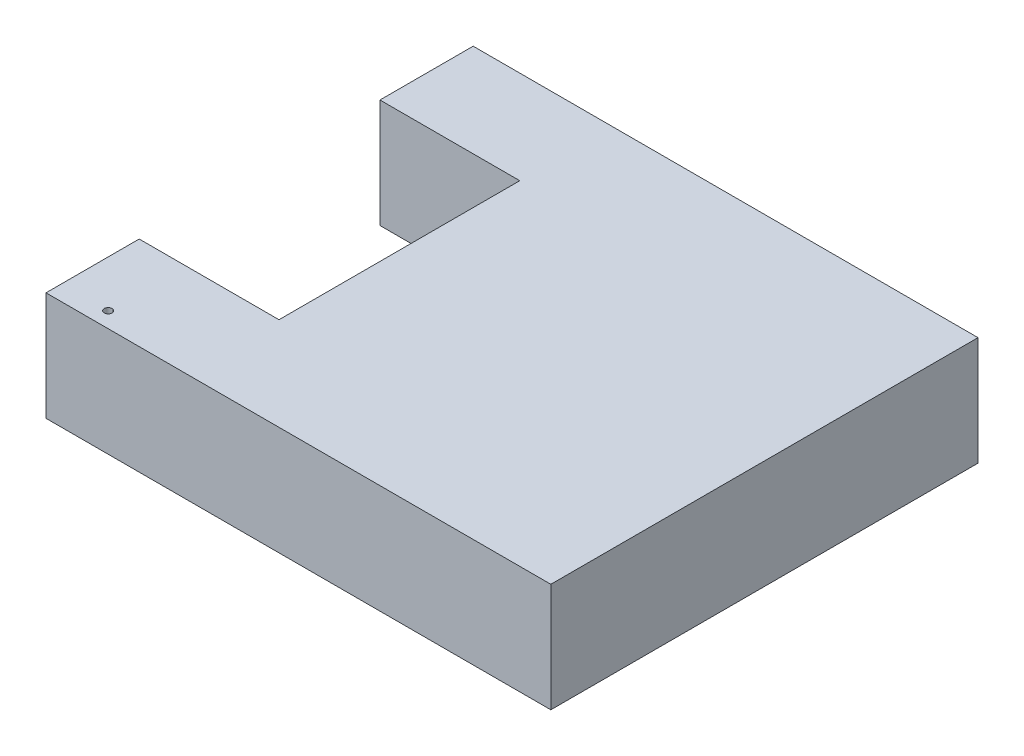
ISO-10303-21;
HEADER;
FILE_DESCRIPTION(('STEP AP214'),'2;1');
FILE_NAME('part.step','',(''),(''),'','','');
FILE_SCHEMA(('AUTOMOTIVE_DESIGN { 1 0 10303 214 1 1 1 1 }'));
ENDSEC;
DATA;
#1=APPLICATION_CONTEXT('core data for automotive mechanical design processes');
#2=APPLICATION_PROTOCOL_DEFINITION('international standard','automotive_design',2000,#1);
#3=PRODUCT_CONTEXT('',#1,'mechanical');
#4=PRODUCT('Part','Part','',(#3));
#5=PRODUCT_RELATED_PRODUCT_CATEGORY('part','',(#4));
#6=PRODUCT_DEFINITION_FORMATION('','',#4);
#7=PRODUCT_DEFINITION_CONTEXT('part definition',#1,'design');
#8=PRODUCT_DEFINITION('design','',#6,#7);
#9=PRODUCT_DEFINITION_SHAPE('','',#8);
#10=(LENGTH_UNIT() NAMED_UNIT(*) SI_UNIT(.MILLI.,.METRE.));
#11=(NAMED_UNIT(*) PLANE_ANGLE_UNIT() SI_UNIT($,.RADIAN.));
#12=(NAMED_UNIT(*) SI_UNIT($,.STERADIAN.) SOLID_ANGLE_UNIT());
#13=UNCERTAINTY_MEASURE_WITH_UNIT(LENGTH_MEASURE(1.E-05),#10,'distance_accuracy_value','');
#14=(GEOMETRIC_REPRESENTATION_CONTEXT(3) GLOBAL_UNCERTAINTY_ASSIGNED_CONTEXT((#13)) GLOBAL_UNIT_ASSIGNED_CONTEXT((#10,
#11,#12)) REPRESENTATION_CONTEXT('',''));
#15=CARTESIAN_POINT('',(0.,0.,0.));
#16=DIRECTION('',(0.,0.,1.));
#17=DIRECTION('',(1.,0.,0.));
#18=AXIS2_PLACEMENT_3D('',#15,#16,#17);
#19=CARTESIAN_POINT('',(0.,177.8,0.));
#20=DIRECTION('',(1.,0.,0.));
#21=DIRECTION('',(0.,0.,-1.));
#22=AXIS2_PLACEMENT_3D('',#19,#20,#21);
#23=PLANE('',#22);
#24=DIRECTION('',(0.,0.,1.));
#25=VECTOR('',#24,1.);
#26=CARTESIAN_POINT('',(0.,0.,0.));
#27=LINE('',#26,#25);
#28=CARTESIAN_POINT('',(0.,0.,-152.4));
#29=VERTEX_POINT('',#28);
#30=CARTESIAN_POINT('',(0.,0.,0.));
#31=VERTEX_POINT('',#30);
#32=EDGE_CURVE('E129',#29,#31,#27,.T.);
#33=ORIENTED_EDGE('',*,*,#32,.T.);
#34=DIRECTION('',(0.,-1.,0.));
#35=VECTOR('',#34,1.);
#36=CARTESIAN_POINT('',(0.,177.8,0.));
#37=LINE('',#36,#35);
#38=CARTESIAN_POINT('',(0.,177.8,0.));
#39=VERTEX_POINT('',#38);
#40=EDGE_CURVE('E11',#39,#31,#37,.T.);
#41=ORIENTED_EDGE('',*,*,#40,.F.);
#42=DIRECTION('',(0.,0.,1.));
#43=VECTOR('',#42,1.);
#44=CARTESIAN_POINT('',(0.,177.8,0.));
#45=LINE('',#44,#43);
#46=CARTESIAN_POINT('',(0.,177.8,-152.4));
#47=VERTEX_POINT('',#46);
#48=EDGE_CURVE('E144',#47,#39,#45,.T.);
#49=ORIENTED_EDGE('',*,*,#48,.F.);
#50=DIRECTION('',(0.,-1.,0.));
#51=VECTOR('',#50,1.);
#52=CARTESIAN_POINT('',(0.,177.8,-152.4));
#53=LINE('',#52,#51);
#54=EDGE_CURVE('E125',#47,#29,#53,.T.);
#55=ORIENTED_EDGE('',*,*,#54,.T.);
#56=EDGE_LOOP('',(#33,#41,#49,#55));
#57=FACE_BOUND('',#56,.T.);
#58=ADVANCED_FACE('F33',(#57),#23,.F.);
#59=CARTESIAN_POINT('',(0.,177.8,0.));
#60=DIRECTION('',(0.,0.,-1.));
#61=DIRECTION('',(-1.,0.,0.));
#62=AXIS2_PLACEMENT_3D('',#59,#60,#61);
#63=PLANE('',#62);
#64=DIRECTION('',(1.,0.,0.));
#65=VECTOR('',#64,1.);
#66=CARTESIAN_POINT('',(0.,0.,0.));
#67=LINE('',#66,#65);
#68=CARTESIAN_POINT('',(825.5,0.,0.));
#69=VERTEX_POINT('',#68);
#70=EDGE_CURVE('E132',#31,#69,#67,.T.);
#71=ORIENTED_EDGE('',*,*,#70,.T.);
#72=DIRECTION('',(0.,-1.,0.));
#73=VECTOR('',#72,1.);
#74=CARTESIAN_POINT('',(825.5,177.8,0.));
#75=LINE('',#74,#73);
#76=CARTESIAN_POINT('',(825.5,177.8,0.));
#77=VERTEX_POINT('',#76);
#78=EDGE_CURVE('E41',#77,#69,#75,.T.);
#79=ORIENTED_EDGE('',*,*,#78,.F.);
#80=DIRECTION('',(1.,0.,0.));
#81=VECTOR('',#80,1.);
#82=CARTESIAN_POINT('',(0.,177.8,0.));
#83=LINE('',#82,#81);
#84=EDGE_CURVE('E92',#39,#77,#83,.T.);
#85=ORIENTED_EDGE('',*,*,#84,.F.);
#86=ORIENTED_EDGE('',*,*,#40,.T.);
#87=EDGE_LOOP('',(#71,#79,#85,#86));
#88=FACE_BOUND('',#87,.T.);
#89=ADVANCED_FACE('F199',(#88),#63,.F.);
#90=CARTESIAN_POINT('',(825.5,177.8,0.));
#91=DIRECTION('',(-1.,0.,0.));
#92=DIRECTION('',(0.,0.,1.));
#93=AXIS2_PLACEMENT_3D('',#90,#91,#92);
#94=PLANE('',#93);
#95=DIRECTION('',(0.,0.,-1.));
#96=VECTOR('',#95,1.);
#97=CARTESIAN_POINT('',(825.5,0.,0.));
#98=LINE('',#97,#96);
#99=CARTESIAN_POINT('',(825.5,0.,-698.5));
#100=VERTEX_POINT('',#99);
#101=EDGE_CURVE('E135',#69,#100,#98,.T.);
#102=ORIENTED_EDGE('',*,*,#101,.T.);
#103=DIRECTION('',(0.,-1.,0.));
#104=VECTOR('',#103,1.);
#105=CARTESIAN_POINT('',(825.5,177.8,-698.5));
#106=LINE('',#105,#104);
#107=CARTESIAN_POINT('',(825.5,177.8,-698.5));
#108=VERTEX_POINT('',#107);
#109=EDGE_CURVE('E151',#108,#100,#106,.T.);
#110=ORIENTED_EDGE('',*,*,#109,.F.);
#111=DIRECTION('',(0.,0.,-1.));
#112=VECTOR('',#111,1.);
#113=CARTESIAN_POINT('',(825.5,177.8,0.));
#114=LINE('',#113,#112);
#115=EDGE_CURVE('E159',#77,#108,#114,.T.);
#116=ORIENTED_EDGE('',*,*,#115,.F.);
#117=ORIENTED_EDGE('',*,*,#78,.T.);
#118=EDGE_LOOP('',(#102,#110,#116,#117));
#119=FACE_BOUND('',#118,.T.);
#120=ADVANCED_FACE('F157',(#119),#94,.F.);
#121=CARTESIAN_POINT('',(0.,177.8,-698.5));
#122=DIRECTION('',(0.,0.,1.));
#123=DIRECTION('',(1.,0.,0.));
#124=AXIS2_PLACEMENT_3D('',#121,#122,#123);
#125=PLANE('',#124);
#126=DIRECTION('',(-1.,0.,0.));
#127=VECTOR('',#126,1.);
#128=CARTESIAN_POINT('',(0.,0.,-698.5));
#129=LINE('',#128,#127);
#130=CARTESIAN_POINT('',(0.,0.,-698.5));
#131=VERTEX_POINT('',#130);
#132=EDGE_CURVE('E137',#100,#131,#129,.T.);
#133=ORIENTED_EDGE('',*,*,#132,.T.);
#134=DIRECTION('',(0.,-1.,0.));
#135=VECTOR('',#134,1.);
#136=CARTESIAN_POINT('',(0.,177.8,-698.5));
#137=LINE('',#136,#135);
#138=CARTESIAN_POINT('',(0.,177.8,-698.5));
#139=VERTEX_POINT('',#138);
#140=EDGE_CURVE('E148',#139,#131,#137,.T.);
#141=ORIENTED_EDGE('',*,*,#140,.F.);
#142=DIRECTION('',(-1.,0.,0.));
#143=VECTOR('',#142,1.);
#144=CARTESIAN_POINT('',(0.,177.8,-698.5));
#145=LINE('',#144,#143);
#146=EDGE_CURVE('E171',#108,#139,#145,.T.);
#147=ORIENTED_EDGE('',*,*,#146,.F.);
#148=ORIENTED_EDGE('',*,*,#109,.T.);
#149=EDGE_LOOP('',(#133,#141,#147,#148));
#150=FACE_BOUND('',#149,.T.);
#151=ADVANCED_FACE('F167',(#150),#125,.F.);
#152=CARTESIAN_POINT('',(0.,177.8,-546.1));
#153=DIRECTION('',(1.,0.,0.));
#154=DIRECTION('',(0.,0.,-1.));
#155=AXIS2_PLACEMENT_3D('',#152,#153,#154);
#156=PLANE('',#155);
#157=DIRECTION('',(0.,0.,1.));
#158=VECTOR('',#157,1.);
#159=CARTESIAN_POINT('',(0.,0.,-546.1));
#160=LINE('',#159,#158);
#161=CARTESIAN_POINT('',(0.,0.,-546.1));
#162=VERTEX_POINT('',#161);
#163=EDGE_CURVE('E139',#131,#162,#160,.T.);
#164=ORIENTED_EDGE('',*,*,#163,.T.);
#165=DIRECTION('',(0.,-1.,0.));
#166=VECTOR('',#165,1.);
#167=CARTESIAN_POINT('',(0.,177.8,-546.1));
#168=LINE('',#167,#166);
#169=CARTESIAN_POINT('',(0.,177.8,-546.1));
#170=VERTEX_POINT('',#169);
#171=EDGE_CURVE('E120',#170,#162,#168,.T.);
#172=ORIENTED_EDGE('',*,*,#171,.F.);
#173=DIRECTION('',(0.,0.,1.));
#174=VECTOR('',#173,1.);
#175=CARTESIAN_POINT('',(0.,177.8,-546.1));
#176=LINE('',#175,#174);
#177=EDGE_CURVE('E111',#139,#170,#176,.T.);
#178=ORIENTED_EDGE('',*,*,#177,.F.);
#179=ORIENTED_EDGE('',*,*,#140,.T.);
#180=EDGE_LOOP('',(#164,#172,#178,#179));
#181=FACE_BOUND('',#180,.T.);
#182=ADVANCED_FACE('F170',(#181),#156,.F.);
#183=CARTESIAN_POINT('',(0.,177.8,-546.1));
#184=DIRECTION('',(0.,0.,-1.));
#185=DIRECTION('',(-1.,0.,0.));
#186=AXIS2_PLACEMENT_3D('',#183,#184,#185);
#187=PLANE('',#186);
#188=DIRECTION('',(1.,0.,0.));
#189=VECTOR('',#188,1.);
#190=CARTESIAN_POINT('',(0.,0.,-546.1));
#191=LINE('',#190,#189);
#192=CARTESIAN_POINT('',(228.6,0.,-546.1));
#193=VERTEX_POINT('',#192);
#194=EDGE_CURVE('E119',#162,#193,#191,.T.);
#195=ORIENTED_EDGE('',*,*,#194,.T.);
#196=DIRECTION('',(0.,-1.,0.));
#197=VECTOR('',#196,1.);
#198=CARTESIAN_POINT('',(228.6,177.8,-546.1));
#199=LINE('',#198,#197);
#200=CARTESIAN_POINT('',(228.6,177.8,-546.1));
#201=VERTEX_POINT('',#200);
#202=EDGE_CURVE('E116',#201,#193,#199,.T.);
#203=ORIENTED_EDGE('',*,*,#202,.F.);
#204=DIRECTION('',(1.,0.,0.));
#205=VECTOR('',#204,1.);
#206=CARTESIAN_POINT('',(0.,177.8,-546.1));
#207=LINE('',#206,#205);
#208=EDGE_CURVE('E105',#170,#201,#207,.T.);
#209=ORIENTED_EDGE('',*,*,#208,.F.);
#210=ORIENTED_EDGE('',*,*,#171,.T.);
#211=EDGE_LOOP('',(#195,#203,#209,#210));
#212=FACE_BOUND('',#211,.T.);
#213=ADVANCED_FACE('F117',(#212),#187,.F.);
#214=CARTESIAN_POINT('',(228.6,177.8,-152.4));
#215=DIRECTION('',(1.,0.,0.));
#216=DIRECTION('',(0.,0.,-1.));
#217=AXIS2_PLACEMENT_3D('',#214,#215,#216);
#218=PLANE('',#217);
#219=DIRECTION('',(0.,0.,1.));
#220=VECTOR('',#219,1.);
#221=CARTESIAN_POINT('',(228.6,0.,-152.4));
#222=LINE('',#221,#220);
#223=CARTESIAN_POINT('',(228.6,0.,-152.4));
#224=VERTEX_POINT('',#223);
#225=EDGE_CURVE('E78',#193,#224,#222,.T.);
#226=ORIENTED_EDGE('',*,*,#225,.T.);
#227=DIRECTION('',(0.,-1.,0.));
#228=VECTOR('',#227,1.);
#229=CARTESIAN_POINT('',(228.6,177.8,-152.4));
#230=LINE('',#229,#228);
#231=CARTESIAN_POINT('',(228.6,177.8,-152.4));
#232=VERTEX_POINT('',#231);
#233=EDGE_CURVE('E121',#232,#224,#230,.T.);
#234=ORIENTED_EDGE('',*,*,#233,.F.);
#235=DIRECTION('',(0.,0.,1.));
#236=VECTOR('',#235,1.);
#237=CARTESIAN_POINT('',(228.6,177.8,-152.4));
#238=LINE('',#237,#236);
#239=EDGE_CURVE('E109',#201,#232,#238,.T.);
#240=ORIENTED_EDGE('',*,*,#239,.F.);
#241=ORIENTED_EDGE('',*,*,#202,.T.);
#242=EDGE_LOOP('',(#226,#234,#240,#241));
#243=FACE_BOUND('',#242,.T.);
#244=ADVANCED_FACE('F123',(#243),#218,.F.);
#245=CARTESIAN_POINT('',(0.,177.8,-152.4));
#246=DIRECTION('',(0.,0.,1.));
#247=DIRECTION('',(1.,0.,0.));
#248=AXIS2_PLACEMENT_3D('',#245,#246,#247);
#249=PLANE('',#248);
#250=DIRECTION('',(-1.,0.,0.));
#251=VECTOR('',#250,1.);
#252=CARTESIAN_POINT('',(0.,0.,-152.4));
#253=LINE('',#252,#251);
#254=EDGE_CURVE('E84',#224,#29,#253,.T.);
#255=ORIENTED_EDGE('',*,*,#254,.T.);
#256=ORIENTED_EDGE('',*,*,#54,.F.);
#257=DIRECTION('',(-1.,0.,0.));
#258=VECTOR('',#257,1.);
#259=CARTESIAN_POINT('',(0.,177.8,-152.4));
#260=LINE('',#259,#258);
#261=EDGE_CURVE('E49',#232,#47,#260,.T.);
#262=ORIENTED_EDGE('',*,*,#261,.F.);
#263=ORIENTED_EDGE('',*,*,#233,.T.);
#264=EDGE_LOOP('',(#255,#256,#262,#263));
#265=FACE_BOUND('',#264,.T.);
#266=ADVANCED_FACE('F195',(#265),#249,.F.);
#267=CARTESIAN_POINT('',(0.,177.8,0.));
#268=DIRECTION('',(0.,-1.,0.));
#269=DIRECTION('',(0.,0.,-1.));
#270=AXIS2_PLACEMENT_3D('',#267,#268,#269);
#271=PLANE('',#270);
#272=CARTESIAN_POINT('',(76.2,177.8,-25.4));
#273=DIRECTION('',(0.,-1.,0.));
#274=DIRECTION('',(0.,0.,-1.));
#275=AXIS2_PLACEMENT_3D('',#272,#273,#274);
#276=CIRCLE('',#275,6.35);
#277=CARTESIAN_POINT('',(76.2,177.8,-31.75));
#278=VERTEX_POINT('',#277);
#279=EDGE_CURVE('E133',#278,#278,#276,.T.);
#280=ORIENTED_EDGE('',*,*,#279,.T.);
#281=EDGE_LOOP('',(#280));
#282=FACE_BOUND('',#281,.T.);
#283=ORIENTED_EDGE('',*,*,#48,.T.);
#284=ORIENTED_EDGE('',*,*,#84,.T.);
#285=ORIENTED_EDGE('',*,*,#115,.T.);
#286=ORIENTED_EDGE('',*,*,#146,.T.);
#287=ORIENTED_EDGE('',*,*,#177,.T.);
#288=ORIENTED_EDGE('',*,*,#208,.T.);
#289=ORIENTED_EDGE('',*,*,#239,.T.);
#290=ORIENTED_EDGE('',*,*,#261,.T.);
#291=EDGE_LOOP('',(#283,#284,#285,#286,#287,#288,#289,#290));
#292=FACE_BOUND('',#291,.T.);
#293=ADVANCED_FACE('F107',(#282,#292),#271,.F.);
#294=CARTESIAN_POINT('',(0.,0.,0.));
#295=DIRECTION('',(0.,-1.,0.));
#296=DIRECTION('',(0.,0.,-1.));
#297=AXIS2_PLACEMENT_3D('',#294,#295,#296);
#298=PLANE('',#297);
#299=CARTESIAN_POINT('',(76.2,0.,-25.4));
#300=DIRECTION('',(0.,-1.,0.));
#301=DIRECTION('',(0.,0.,-1.));
#302=AXIS2_PLACEMENT_3D('',#299,#300,#301);
#303=CIRCLE('',#302,6.35);
#304=CARTESIAN_POINT('',(76.2,0.,-31.75));
#305=VERTEX_POINT('',#304);
#306=EDGE_CURVE('E177',#305,#305,#303,.T.);
#307=ORIENTED_EDGE('',*,*,#306,.F.);
#308=EDGE_LOOP('',(#307));
#309=FACE_BOUND('',#308,.T.);
#310=ORIENTED_EDGE('',*,*,#32,.F.);
#311=ORIENTED_EDGE('',*,*,#254,.F.);
#312=ORIENTED_EDGE('',*,*,#225,.F.);
#313=ORIENTED_EDGE('',*,*,#194,.F.);
#314=ORIENTED_EDGE('',*,*,#163,.F.);
#315=ORIENTED_EDGE('',*,*,#132,.F.);
#316=ORIENTED_EDGE('',*,*,#101,.F.);
#317=ORIENTED_EDGE('',*,*,#70,.F.);
#318=EDGE_LOOP('',(#310,#311,#312,#313,#314,#315,#316,#317));
#319=FACE_BOUND('',#318,.T.);
#320=ADVANCED_FACE('F163',(#309,#319),#298,.T.);
#321=CARTESIAN_POINT('',(76.2,177.8,-25.4));
#322=DIRECTION('',(0.,-1.,0.));
#323=DIRECTION('',(0.,0.,-1.));
#324=AXIS2_PLACEMENT_3D('',#321,#322,#323);
#325=CYLINDRICAL_SURFACE('',#324,6.35);
#326=ORIENTED_EDGE('',*,*,#279,.F.);
#327=EDGE_LOOP('',(#326));
#328=FACE_BOUND('',#327,.T.);
#329=ORIENTED_EDGE('',*,*,#306,.T.);
#330=EDGE_LOOP('',(#329));
#331=FACE_BOUND('',#330,.T.);
#332=ADVANCED_FACE('F184',(#328,#331),#325,.F.);
#333=CLOSED_SHELL('',(#58,#89,#120,#151,#182,#213,#244,#266,#293,#320,#332));
#334=MANIFOLD_SOLID_BREP('B2',#333);
#335=ADVANCED_BREP_SHAPE_REPRESENTATION('',(#18,#334),#14);
#336=SHAPE_DEFINITION_REPRESENTATION(#9,#335);
ENDSEC;
END-ISO-10303-21;
